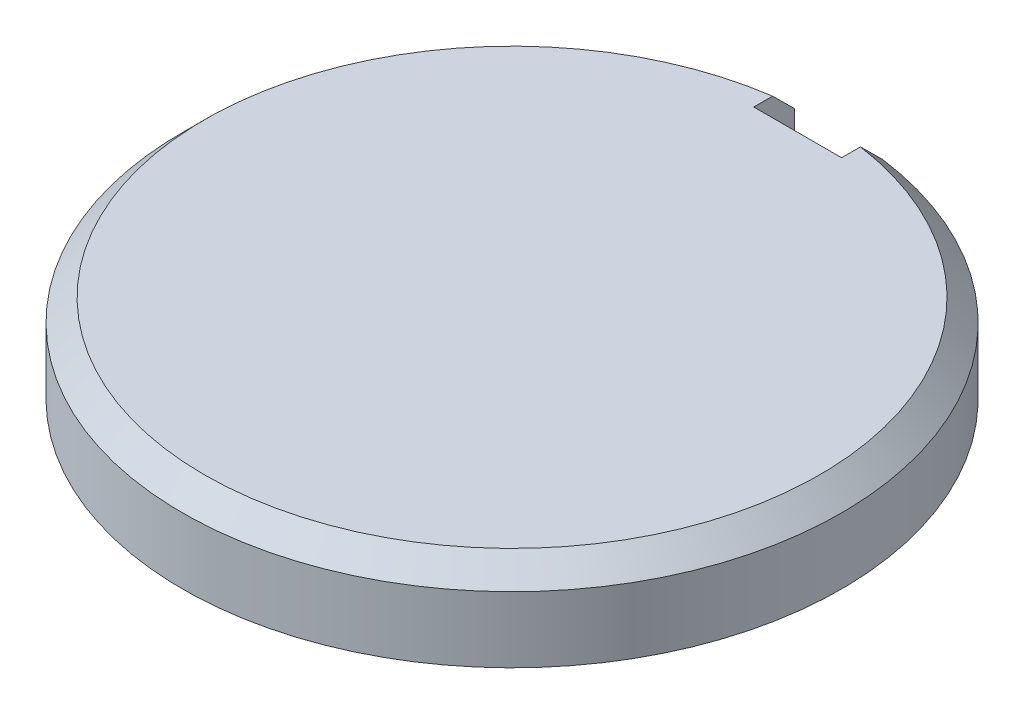
ISO-10303-21;
HEADER;
FILE_DESCRIPTION(('STEP AP214'),'2;1');
FILE_NAME('part.step','',(''),(''),'','','');
FILE_SCHEMA(('AUTOMOTIVE_DESIGN { 1 0 10303 214 1 1 1 1 }'));
ENDSEC;
DATA;
#1=APPLICATION_CONTEXT('core data for automotive mechanical design processes');
#2=APPLICATION_PROTOCOL_DEFINITION('international standard','automotive_design',2000,#1);
#3=PRODUCT_CONTEXT('',#1,'mechanical');
#4=PRODUCT('Part','Part','',(#3));
#5=PRODUCT_RELATED_PRODUCT_CATEGORY('part','',(#4));
#6=PRODUCT_DEFINITION_FORMATION('','',#4);
#7=PRODUCT_DEFINITION_CONTEXT('part definition',#1,'design');
#8=PRODUCT_DEFINITION('design','',#6,#7);
#9=PRODUCT_DEFINITION_SHAPE('','',#8);
#10=(LENGTH_UNIT() NAMED_UNIT(*) SI_UNIT(.MILLI.,.METRE.));
#11=(NAMED_UNIT(*) PLANE_ANGLE_UNIT() SI_UNIT($,.RADIAN.));
#12=(NAMED_UNIT(*) SI_UNIT($,.STERADIAN.) SOLID_ANGLE_UNIT());
#13=UNCERTAINTY_MEASURE_WITH_UNIT(LENGTH_MEASURE(1.E-05),#10,'distance_accuracy_value','');
#14=(GEOMETRIC_REPRESENTATION_CONTEXT(3) GLOBAL_UNCERTAINTY_ASSIGNED_CONTEXT((#13)) GLOBAL_UNIT_ASSIGNED_CONTEXT((#10,
#11,#12)) REPRESENTATION_CONTEXT('',''));
#15=CARTESIAN_POINT('',(0.,0.,0.));
#16=DIRECTION('',(0.,0.,1.));
#17=DIRECTION('',(1.,0.,0.));
#18=AXIS2_PLACEMENT_3D('',#15,#16,#17);
#19=CARTESIAN_POINT('',(0.,52.2,-62.));
#20=DIRECTION('',(0.,1.,0.));
#21=DIRECTION('',(0.,0.,1.));
#22=AXIS2_PLACEMENT_3D('',#19,#20,#21);
#23=PLANE('',#22);
#24=DIRECTION('',(-1.,0.,0.));
#25=VECTOR('',#24,1.);
#26=CARTESIAN_POINT('',(0.,52.2,-67.2));
#27=LINE('',#26,#25);
#28=CARTESIAN_POINT('',(0.8,52.2,-67.2));
#29=VERTEX_POINT('',#28);
#30=CARTESIAN_POINT('',(-0.8,52.2,-67.2));
#31=VERTEX_POINT('',#30);
#32=EDGE_CURVE('E204',#29,#31,#27,.T.);
#33=ORIENTED_EDGE('',*,*,#32,.T.);
#34=DIRECTION('',(0.,0.,-1.));
#35=VECTOR('',#34,1.);
#36=CARTESIAN_POINT('',(-0.8,52.2,-62.));
#37=LINE('',#36,#35);
#38=CARTESIAN_POINT('',(-0.8,52.2,-67.5425625842204));
#39=VERTEX_POINT('',#38);
#40=EDGE_CURVE('E191',#31,#39,#37,.T.);
#41=ORIENTED_EDGE('',*,*,#40,.T.);
#42=CARTESIAN_POINT('',(0.,52.2,-62.));
#43=DIRECTION('',(0.,-1.,0.));
#44=DIRECTION('',(0.,0.,-1.));
#45=AXIS2_PLACEMENT_3D('',#42,#43,#44);
#46=CIRCLE('',#45,5.6);
#47=CARTESIAN_POINT('',(0.8,52.2,-67.5425625842204));
#48=VERTEX_POINT('',#47);
#49=EDGE_CURVE('E355',#48,#39,#46,.T.);
#50=ORIENTED_EDGE('',*,*,#49,.F.);
#51=DIRECTION('',(0.,0.,1.));
#52=VECTOR('',#51,1.);
#53=CARTESIAN_POINT('',(0.8,52.2,-62.));
#54=LINE('',#53,#52);
#55=EDGE_CURVE('E210',#48,#29,#54,.T.);
#56=ORIENTED_EDGE('',*,*,#55,.T.);
#57=EDGE_LOOP('',(#33,#41,#50,#56));
#58=FACE_BOUND('',#57,.T.);
#59=ADVANCED_FACE('F47',(#58),#23,.T.);
#60=CARTESIAN_POINT('',(0.,51.8,-62.));
#61=DIRECTION('',(0.,-1.,0.));
#62=DIRECTION('',(0.,0.,-1.));
#63=AXIS2_PLACEMENT_3D('',#60,#61,#62);
#64=CONICAL_SURFACE('',#63,6.,0.785398163397452);
#65=ORIENTED_EDGE('',*,*,#49,.T.);
#66=CARTESIAN_POINT('',(-0.8,53.0946271909999,-66.6368667515551));
#67=CARTESIAN_POINT('',(-0.8,52.9126166868986,-66.8215553370668));
#68=CARTESIAN_POINT('',(-0.8,52.7304582431577,-67.0060979425622));
#69=CARTESIAN_POINT('',(-0.8,52.3659108831408,-67.374955064313));
#70=CARTESIAN_POINT('',(-0.8,52.1835219670777,-67.5592695807787));
#71=CARTESIAN_POINT('',(-0.8,51.8185788185969,-67.9277346494659));
#72=CARTESIAN_POINT('',(-0.8,51.6360245862569,-68.1118852017641));
#73=CARTESIAN_POINT('',(-0.8,51.2707866928955,-68.4800582504329));
#74=CARTESIAN_POINT('',(-0.8,51.0881030317565,-68.6640807466868));
#75=CARTESIAN_POINT('',(-0.8,50.9053728090001,-68.8480569582091));
#76=B_SPLINE_CURVE_WITH_KNOTS('',3,(#66,#67,#68,#69,#70,#71,#72,#73,#74,#75),.UNSPECIFIED.,.F.,
.F.,(4,2,2,2,4),(0.,0.777906711944224,1.55581270618922,2.33371833583191,3.11162467374074),.UNSPECIFIED.);
#77=CARTESIAN_POINT('',(-0.8,51.8,-67.9464274989274));
#78=VERTEX_POINT('',#77);
#79=EDGE_CURVE('E196',#39,#78,#76,.T.);
#80=ORIENTED_EDGE('',*,*,#79,.T.);
#81=CARTESIAN_POINT('',(0.,51.8,-62.));
#82=DIRECTION('',(0.,-1.,0.));
#83=DIRECTION('',(0.,0.,-1.));
#84=AXIS2_PLACEMENT_3D('',#81,#82,#83);
#85=CIRCLE('',#84,6.);
#86=CARTESIAN_POINT('',(0.8,51.8,-67.9464274989274));
#87=VERTEX_POINT('',#86);
#88=EDGE_CURVE('E351',#87,#78,#85,.T.);
#89=ORIENTED_EDGE('',*,*,#88,.F.);
#90=CARTESIAN_POINT('',(0.8,50.9053728090001,-68.8480569582091));
#91=CARTESIAN_POINT('',(0.8,51.0881030317565,-68.6640807466868));
#92=CARTESIAN_POINT('',(0.8,51.2707866928955,-68.4800582504329));
#93=CARTESIAN_POINT('',(0.8,51.6360245862569,-68.1118852017641));
#94=CARTESIAN_POINT('',(0.8,51.8185788185969,-67.9277346494659));
#95=CARTESIAN_POINT('',(0.8,52.1835219670777,-67.5592695807787));
#96=CARTESIAN_POINT('',(0.8,52.3659108831408,-67.374955064313));
#97=CARTESIAN_POINT('',(0.8,52.7304582431577,-67.0060979425621));
#98=CARTESIAN_POINT('',(0.8,52.9126166868986,-66.8215553370668));
#99=CARTESIAN_POINT('',(0.8,53.0946271909999,-66.6368667515551));
#100=B_SPLINE_CURVE_WITH_KNOTS('',3,(#90,#91,#92,#93,#94,#95,#96,#97,#98,#99),.UNSPECIFIED.,.F.,
.F.,(4,2,2,2,4),(0.,0.777906337908827,1.55581196755152,2.33371796179654,3.11162467374074),.UNSPECIFIED.);
#101=EDGE_CURVE('E217',#87,#48,#100,.T.);
#102=ORIENTED_EDGE('',*,*,#101,.T.);
#103=EDGE_LOOP('',(#65,#80,#89,#102));
#104=FACE_BOUND('',#103,.T.);
#105=ADVANCED_FACE('F231',(#104),#64,.T.);
#106=CARTESIAN_POINT('',(0.,44.4,-62.));
#107=DIRECTION('',(0.,-1.,0.));
#108=DIRECTION('',(0.,0.,-1.));
#109=AXIS2_PLACEMENT_3D('',#106,#107,#108);
#110=CYLINDRICAL_SURFACE('',#109,6.);
#111=ORIENTED_EDGE('',*,*,#88,.T.);
#112=DIRECTION('',(0.,-1.,0.));
#113=VECTOR('',#112,1.);
#114=CARTESIAN_POINT('',(-0.8,44.4,-67.9464274989274));
#115=LINE('',#114,#113);
#116=CARTESIAN_POINT('',(-0.8,50.6,-67.9464274989274));
#117=VERTEX_POINT('',#116);
#118=EDGE_CURVE('E253',#78,#117,#115,.T.);
#119=ORIENTED_EDGE('',*,*,#118,.T.);
#120=CARTESIAN_POINT('',(0.,50.6,-62.));
#121=DIRECTION('',(0.,-1.,0.));
#122=DIRECTION('',(0.,0.,-1.));
#123=AXIS2_PLACEMENT_3D('',#120,#121,#122);
#124=CIRCLE('',#123,6.);
#125=CARTESIAN_POINT('',(0.8,50.6,-67.9464274989274));
#126=VERTEX_POINT('',#125);
#127=EDGE_CURVE('E347',#126,#117,#124,.T.);
#128=ORIENTED_EDGE('',*,*,#127,.F.);
#129=DIRECTION('',(0.,-1.,0.));
#130=VECTOR('',#129,1.);
#131=CARTESIAN_POINT('',(0.8,44.4,-67.9464274989274));
#132=LINE('',#131,#130);
#133=EDGE_CURVE('E212',#126,#87,#132,.F.);
#134=ORIENTED_EDGE('',*,*,#133,.T.);
#135=EDGE_LOOP('',(#111,#119,#128,#134));
#136=FACE_BOUND('',#135,.T.);
#137=ADVANCED_FACE('F417',(#136),#110,.T.);
#138=CARTESIAN_POINT('',(6.,50.6,-62.));
#139=DIRECTION('',(0.,-1.,0.));
#140=DIRECTION('',(0.,0.,-1.));
#141=AXIS2_PLACEMENT_3D('',#138,#139,#140);
#142=PLANE('',#141);
#143=CARTESIAN_POINT('',(0.,50.6,-62.));
#144=DIRECTION('',(0.,-1.,0.));
#145=DIRECTION('',(0.,0.,-1.));
#146=AXIS2_PLACEMENT_3D('',#143,#144,#145);
#147=CIRCLE('',#146,3.);
#148=CARTESIAN_POINT('',(0.,50.6,-65.));
#149=VERTEX_POINT('',#148);
#150=EDGE_CURVE('E341',#149,#149,#147,.T.);
#151=ORIENTED_EDGE('',*,*,#150,.F.);
#152=EDGE_LOOP('',(#151));
#153=FACE_BOUND('',#152,.T.);
#154=ORIENTED_EDGE('',*,*,#127,.T.);
#155=DIRECTION('',(0.,0.,1.));
#156=VECTOR('',#155,1.);
#157=CARTESIAN_POINT('',(-0.8,50.6,-62.));
#158=LINE('',#157,#156);
#159=CARTESIAN_POINT('',(-0.8,50.6,-67.2));
#160=VERTEX_POINT('',#159);
#161=EDGE_CURVE('E11',#117,#160,#158,.T.);
#162=ORIENTED_EDGE('',*,*,#161,.T.);
#163=DIRECTION('',(1.,0.,0.));
#164=VECTOR('',#163,1.);
#165=CARTESIAN_POINT('',(6.,50.6,-67.2));
#166=LINE('',#165,#164);
#167=CARTESIAN_POINT('',(0.8,50.6,-67.2));
#168=VERTEX_POINT('',#167);
#169=EDGE_CURVE('E206',#160,#168,#166,.T.);
#170=ORIENTED_EDGE('',*,*,#169,.T.);
#171=DIRECTION('',(0.,0.,-1.));
#172=VECTOR('',#171,1.);
#173=CARTESIAN_POINT('',(0.8,50.6,-62.));
#174=LINE('',#173,#172);
#175=EDGE_CURVE('E56',#168,#126,#174,.T.);
#176=ORIENTED_EDGE('',*,*,#175,.T.);
#177=EDGE_LOOP('',(#154,#162,#170,#176));
#178=FACE_BOUND('',#177,.T.);
#179=ADVANCED_FACE('F414',(#153,#178),#142,.T.);
#180=CARTESIAN_POINT('',(3.,49.4,-62.));
#181=DIRECTION('',(0.,-1.,0.));
#182=DIRECTION('',(0.,0.,-1.));
#183=AXIS2_PLACEMENT_3D('',#180,#181,#182);
#184=PLANE('',#183);
#185=CARTESIAN_POINT('',(0.,49.4,-62.));
#186=DIRECTION('',(0.,-1.,0.));
#187=DIRECTION('',(0.,0.,-1.));
#188=AXIS2_PLACEMENT_3D('',#185,#186,#187);
#189=CIRCLE('',#188,3.);
#190=CARTESIAN_POINT('',(-0.4,49.4,-59.0267862505363));
#191=VERTEX_POINT('',#190);
#192=CARTESIAN_POINT('',(-2.9732137494637,49.4,-61.6));
#193=VERTEX_POINT('',#192);
#194=EDGE_CURVE('E343',#191,#193,#189,.T.);
#195=ORIENTED_EDGE('',*,*,#194,.T.);
#196=DIRECTION('',(1.,0.,0.));
#197=VECTOR('',#196,1.);
#198=CARTESIAN_POINT('',(3.,49.4,-61.6));
#199=LINE('',#198,#197);
#200=CARTESIAN_POINT('',(-2.26495033058123,49.4,-61.6));
#201=VERTEX_POINT('',#200);
#202=EDGE_CURVE('E275',#193,#201,#199,.T.);
#203=ORIENTED_EDGE('',*,*,#202,.T.);
#204=CARTESIAN_POINT('',(0.,49.4,-62.));
#205=DIRECTION('',(0.,-1.,0.));
#206=DIRECTION('',(0.,0.,-1.));
#207=AXIS2_PLACEMENT_3D('',#204,#205,#206);
#208=CIRCLE('',#207,2.3);
#209=CARTESIAN_POINT('',(-0.4,49.4,-59.7350496694188));
#210=VERTEX_POINT('',#209);
#211=EDGE_CURVE('E369',#210,#201,#208,.T.);
#212=ORIENTED_EDGE('',*,*,#211,.F.);
#213=DIRECTION('',(0.,0.,1.));
#214=VECTOR('',#213,1.);
#215=CARTESIAN_POINT('',(-0.4,49.4,-62.));
#216=LINE('',#215,#214);
#217=EDGE_CURVE('E328',#210,#191,#216,.T.);
#218=ORIENTED_EDGE('',*,*,#217,.T.);
#219=EDGE_LOOP('',(#195,#203,#212,#218));
#220=FACE_BOUND('',#219,.T.);
#221=ADVANCED_FACE('F479',(#220),#184,.T.);
#222=CARTESIAN_POINT('',(2.26495033058123,49.4,-61.6));
#223=VERTEX_POINT('',#222);
#224=CARTESIAN_POINT('',(0.4,49.4,-59.7350496694188));
#225=VERTEX_POINT('',#224);
#226=EDGE_CURVE('E368',#223,#225,#208,.T.);
#227=ORIENTED_EDGE('',*,*,#226,.F.);
#228=DIRECTION('',(1.,0.,0.));
#229=VECTOR('',#228,1.);
#230=CARTESIAN_POINT('',(3.,49.4,-61.6));
#231=LINE('',#230,#229);
#232=CARTESIAN_POINT('',(2.9732137494637,49.4,-61.6));
#233=VERTEX_POINT('',#232);
#234=EDGE_CURVE('E283',#223,#233,#231,.T.);
#235=ORIENTED_EDGE('',*,*,#234,.T.);
#236=CARTESIAN_POINT('',(0.4,49.4,-59.0267862505363));
#237=VERTEX_POINT('',#236);
#238=EDGE_CURVE('E342',#233,#237,#189,.T.);
#239=ORIENTED_EDGE('',*,*,#238,.T.);
#240=DIRECTION('',(0.,0.,-1.));
#241=VECTOR('',#240,1.);
#242=CARTESIAN_POINT('',(0.4,49.4,-62.));
#243=LINE('',#242,#241);
#244=EDGE_CURVE('E310',#237,#225,#243,.T.);
#245=ORIENTED_EDGE('',*,*,#244,.T.);
#246=EDGE_LOOP('',(#227,#235,#239,#245));
#247=FACE_BOUND('',#246,.T.);
#248=ADVANCED_FACE('F466',(#247),#184,.T.);
#249=CARTESIAN_POINT('',(0.,44.4,-62.));
#250=DIRECTION('',(0.,-1.,0.));
#251=DIRECTION('',(0.,0.,-1.));
#252=AXIS2_PLACEMENT_3D('',#249,#250,#251);
#253=CYLINDRICAL_SURFACE('',#252,2.3);
#254=CARTESIAN_POINT('',(0.,50.6,-62.));
#255=DIRECTION('',(0.,-1.,0.));
#256=DIRECTION('',(0.,0.,-1.));
#257=AXIS2_PLACEMENT_3D('',#254,#255,#256);
#258=CIRCLE('',#257,2.3);
#259=CARTESIAN_POINT('',(0.,50.6,-64.3));
#260=VERTEX_POINT('',#259);
#261=EDGE_CURVE('E358',#260,#260,#258,.T.);
#262=ORIENTED_EDGE('',*,*,#261,.F.);
#263=EDGE_LOOP('',(#262));
#264=FACE_BOUND('',#263,.T.);
#265=CARTESIAN_POINT('',(0.,50.58,-62.));
#266=DIRECTION('',(0.,-1.,0.));
#267=DIRECTION('',(0.,0.,-1.));
#268=AXIS2_PLACEMENT_3D('',#265,#266,#267);
#269=CIRCLE('',#268,2.3);
#270=CARTESIAN_POINT('',(2.26495033058123,50.58,-62.4));
#271=VERTEX_POINT('',#270);
#272=CARTESIAN_POINT('',(2.26495033058123,50.58,-61.6));
#273=VERTEX_POINT('',#272);
#274=EDGE_CURVE('E295',#271,#273,#269,.T.);
#275=ORIENTED_EDGE('',*,*,#274,.T.);
#276=DIRECTION('',(0.,-1.,0.));
#277=VECTOR('',#276,1.);
#278=CARTESIAN_POINT('',(2.26495033058123,44.4,-61.6));
#279=LINE('',#278,#277);
#280=EDGE_CURVE('E287',#273,#223,#279,.T.);
#281=ORIENTED_EDGE('',*,*,#280,.T.);
#282=ORIENTED_EDGE('',*,*,#226,.T.);
#283=DIRECTION('',(0.,-1.,0.));
#284=VECTOR('',#283,1.);
#285=CARTESIAN_POINT('',(0.4,44.4,-59.7350496694188));
#286=LINE('',#285,#284);
#287=CARTESIAN_POINT('',(0.4,50.58,-59.7350496694188));
#288=VERTEX_POINT('',#287);
#289=EDGE_CURVE('E314',#225,#288,#286,.F.);
#290=ORIENTED_EDGE('',*,*,#289,.T.);
#291=CARTESIAN_POINT('',(0.,50.58,-62.));
#292=DIRECTION('',(0.,-1.,0.));
#293=DIRECTION('',(0.,0.,-1.));
#294=AXIS2_PLACEMENT_3D('',#291,#292,#293);
#295=CIRCLE('',#294,2.3);
#296=CARTESIAN_POINT('',(-0.4,50.58,-59.7350496694188));
#297=VERTEX_POINT('',#296);
#298=EDGE_CURVE('E309',#288,#297,#295,.T.);
#299=ORIENTED_EDGE('',*,*,#298,.T.);
#300=DIRECTION('',(0.,-1.,0.));
#301=VECTOR('',#300,1.);
#302=CARTESIAN_POINT('',(-0.4,44.4,-59.7350496694188));
#303=LINE('',#302,#301);
#304=EDGE_CURVE('E332',#297,#210,#303,.T.);
#305=ORIENTED_EDGE('',*,*,#304,.T.);
#306=ORIENTED_EDGE('',*,*,#211,.T.);
#307=DIRECTION('',(0.,-1.,0.));
#308=VECTOR('',#307,1.);
#309=CARTESIAN_POINT('',(-2.26495033058123,44.4,-61.6));
#310=LINE('',#309,#308);
#311=CARTESIAN_POINT('',(-2.26495033058123,50.58,-61.6));
#312=VERTEX_POINT('',#311);
#313=EDGE_CURVE('E279',#201,#312,#310,.F.);
#314=ORIENTED_EDGE('',*,*,#313,.T.);
#315=CARTESIAN_POINT('',(-2.26495033058123,50.58,-62.4));
#316=VERTEX_POINT('',#315);
#317=EDGE_CURVE('E291',#312,#316,#269,.T.);
#318=ORIENTED_EDGE('',*,*,#317,.T.);
#319=DIRECTION('',(0.,-1.,0.));
#320=VECTOR('',#319,1.);
#321=CARTESIAN_POINT('',(-2.26495033058123,44.4,-62.4));
#322=LINE('',#321,#320);
#323=CARTESIAN_POINT('',(-2.26495033058123,49.4,-62.4));
#324=VERTEX_POINT('',#323);
#325=EDGE_CURVE('E266',#324,#316,#322,.F.);
#326=ORIENTED_EDGE('',*,*,#325,.F.);
#327=CARTESIAN_POINT('',(-0.4,49.4,-64.2649503305812));
#328=VERTEX_POINT('',#327);
#329=EDGE_CURVE('E362',#324,#328,#208,.T.);
#330=ORIENTED_EDGE('',*,*,#329,.T.);
#331=DIRECTION('',(0.,-1.,0.));
#332=VECTOR('',#331,1.);
#333=CARTESIAN_POINT('',(-0.4,44.4,-64.2649503305812));
#334=LINE('',#333,#332);
#335=CARTESIAN_POINT('',(-0.4,50.58,-64.2649503305812));
#336=VERTEX_POINT('',#335);
#337=EDGE_CURVE('E327',#328,#336,#334,.F.);
#338=ORIENTED_EDGE('',*,*,#337,.T.);
#339=CARTESIAN_POINT('',(0.4,50.58,-64.2649503305812));
#340=VERTEX_POINT('',#339);
#341=EDGE_CURVE('E305',#336,#340,#295,.T.);
#342=ORIENTED_EDGE('',*,*,#341,.T.);
#343=DIRECTION('',(0.,-1.,0.));
#344=VECTOR('',#343,1.);
#345=CARTESIAN_POINT('',(0.4,44.4,-64.2649503305812));
#346=LINE('',#345,#344);
#347=CARTESIAN_POINT('',(0.4,49.4,-64.2649503305812));
#348=VERTEX_POINT('',#347);
#349=EDGE_CURVE('E319',#340,#348,#346,.T.);
#350=ORIENTED_EDGE('',*,*,#349,.T.);
#351=CARTESIAN_POINT('',(2.26495033058123,49.4,-62.4));
#352=VERTEX_POINT('',#351);
#353=EDGE_CURVE('E363',#348,#352,#208,.T.);
#354=ORIENTED_EDGE('',*,*,#353,.T.);
#355=DIRECTION('',(0.,-1.,0.));
#356=VECTOR('',#355,1.);
#357=CARTESIAN_POINT('',(2.26495033058123,44.4,-62.4));
#358=LINE('',#357,#356);
#359=EDGE_CURVE('E272',#271,#352,#358,.T.);
#360=ORIENTED_EDGE('',*,*,#359,.F.);
#361=EDGE_LOOP('',(#275,#281,#282,#290,#299,#305,#306,#314,#318,#326,#330,#338,#342,#350,#354,#360));
#362=FACE_BOUND('',#361,.T.);
#363=ADVANCED_FACE('F462',(#264,#362),#253,.F.);
#364=CARTESIAN_POINT('',(0.,44.4,-62.));
#365=DIRECTION('',(0.,-1.,0.));
#366=DIRECTION('',(0.,0.,-1.));
#367=AXIS2_PLACEMENT_3D('',#364,#365,#366);
#368=CYLINDRICAL_SURFACE('',#367,3.);
#369=ORIENTED_EDGE('',*,*,#150,.T.);
#370=EDGE_LOOP('',(#369));
#371=FACE_BOUND('',#370,.T.);
#372=ORIENTED_EDGE('',*,*,#238,.F.);
#373=DIRECTION('',(0.,-1.,0.));
#374=VECTOR('',#373,1.);
#375=CARTESIAN_POINT('',(2.9732137494637,44.4,-61.6));
#376=LINE('',#375,#374);
#377=CARTESIAN_POINT('',(2.9732137494637,50.58,-61.6));
#378=VERTEX_POINT('',#377);
#379=EDGE_CURVE('E405',#233,#378,#376,.F.);
#380=ORIENTED_EDGE('',*,*,#379,.T.);
#381=CARTESIAN_POINT('',(0.,50.58,-62.));
#382=DIRECTION('',(0.,-1.,0.));
#383=DIRECTION('',(0.,0.,-1.));
#384=AXIS2_PLACEMENT_3D('',#381,#382,#383);
#385=CIRCLE('',#384,3.);
#386=CARTESIAN_POINT('',(2.9732137494637,50.58,-62.4));
#387=VERTEX_POINT('',#386);
#388=EDGE_CURVE('E398',#378,#387,#385,.F.);
#389=ORIENTED_EDGE('',*,*,#388,.T.);
#390=DIRECTION('',(0.,-1.,0.));
#391=VECTOR('',#390,1.);
#392=CARTESIAN_POINT('',(2.9732137494637,44.4,-62.4));
#393=LINE('',#392,#391);
#394=CARTESIAN_POINT('',(2.9732137494637,49.4,-62.4));
#395=VERTEX_POINT('',#394);
#396=EDGE_CURVE('E402',#395,#387,#393,.F.);
#397=ORIENTED_EDGE('',*,*,#396,.F.);
#398=CARTESIAN_POINT('',(0.4,49.4,-64.9732137494637));
#399=VERTEX_POINT('',#398);
#400=EDGE_CURVE('E337',#399,#395,#189,.T.);
#401=ORIENTED_EDGE('',*,*,#400,.F.);
#402=DIRECTION('',(0.,-1.,0.));
#403=VECTOR('',#402,1.);
#404=CARTESIAN_POINT('',(0.4,44.4,-64.9732137494637));
#405=LINE('',#404,#403);
#406=CARTESIAN_POINT('',(0.4,50.58,-64.9732137494637));
#407=VERTEX_POINT('',#406);
#408=EDGE_CURVE('E373',#399,#407,#405,.F.);
#409=ORIENTED_EDGE('',*,*,#408,.T.);
#410=CARTESIAN_POINT('',(0.,50.58,-62.));
#411=DIRECTION('',(0.,-1.,0.));
#412=DIRECTION('',(0.,0.,-1.));
#413=AXIS2_PLACEMENT_3D('',#410,#411,#412);
#414=CIRCLE('',#413,3.);
#415=CARTESIAN_POINT('',(-0.4,50.58,-64.9732137494637));
#416=VERTEX_POINT('',#415);
#417=EDGE_CURVE('E367',#407,#416,#414,.F.);
#418=ORIENTED_EDGE('',*,*,#417,.T.);
#419=DIRECTION('',(0.,-1.,0.));
#420=VECTOR('',#419,1.);
#421=CARTESIAN_POINT('',(-0.4,44.4,-64.9732137494637));
#422=LINE('',#421,#420);
#423=CARTESIAN_POINT('',(-0.4,49.4,-64.9732137494637));
#424=VERTEX_POINT('',#423);
#425=EDGE_CURVE('E378',#416,#424,#422,.T.);
#426=ORIENTED_EDGE('',*,*,#425,.T.);
#427=CARTESIAN_POINT('',(-2.9732137494637,49.4,-62.4));
#428=VERTEX_POINT('',#427);
#429=EDGE_CURVE('E336',#428,#424,#189,.T.);
#430=ORIENTED_EDGE('',*,*,#429,.F.);
#431=DIRECTION('',(0.,-1.,0.));
#432=VECTOR('',#431,1.);
#433=CARTESIAN_POINT('',(-2.9732137494637,44.4,-62.4));
#434=LINE('',#433,#432);
#435=CARTESIAN_POINT('',(-2.9732137494637,50.58,-62.4));
#436=VERTEX_POINT('',#435);
#437=EDGE_CURVE('E390',#436,#428,#434,.T.);
#438=ORIENTED_EDGE('',*,*,#437,.F.);
#439=CARTESIAN_POINT('',(-2.9732137494637,50.58,-61.6));
#440=VERTEX_POINT('',#439);
#441=EDGE_CURVE('E393',#436,#440,#385,.F.);
#442=ORIENTED_EDGE('',*,*,#441,.T.);
#443=DIRECTION('',(0.,-1.,0.));
#444=VECTOR('',#443,1.);
#445=CARTESIAN_POINT('',(-2.9732137494637,44.4,-61.6));
#446=LINE('',#445,#444);
#447=EDGE_CURVE('E397',#440,#193,#446,.T.);
#448=ORIENTED_EDGE('',*,*,#447,.T.);
#449=ORIENTED_EDGE('',*,*,#194,.F.);
#450=DIRECTION('',(0.,-1.,0.));
#451=VECTOR('',#450,1.);
#452=CARTESIAN_POINT('',(-0.4,44.4,-59.0267862505363));
#453=LINE('',#452,#451);
#454=CARTESIAN_POINT('',(-0.4,50.58,-59.0267862505363));
#455=VERTEX_POINT('',#454);
#456=EDGE_CURVE('E386',#191,#455,#453,.F.);
#457=ORIENTED_EDGE('',*,*,#456,.T.);
#458=CARTESIAN_POINT('',(0.4,50.58,-59.0267862505363));
#459=VERTEX_POINT('',#458);
#460=EDGE_CURVE('E374',#455,#459,#414,.F.);
#461=ORIENTED_EDGE('',*,*,#460,.T.);
#462=DIRECTION('',(0.,-1.,0.));
#463=VECTOR('',#462,1.);
#464=CARTESIAN_POINT('',(0.4,44.4,-59.0267862505363));
#465=LINE('',#464,#463);
#466=EDGE_CURVE('E382',#459,#237,#465,.T.);
#467=ORIENTED_EDGE('',*,*,#466,.T.);
#468=EDGE_LOOP('',(#372,#380,#389,#397,#401,#409,#418,#426,#430,#438,#442,#448,#449,#457,#461,#467));
#469=FACE_BOUND('',#468,.T.);
#470=ADVANCED_FACE('F452',(#371,#469),#368,.T.);
#471=DIRECTION('',(1.,0.,0.));
#472=VECTOR('',#471,1.);
#473=CARTESIAN_POINT('',(3.,49.4,-62.4));
#474=LINE('',#473,#472);
#475=EDGE_CURVE('E263',#428,#324,#474,.T.);
#476=ORIENTED_EDGE('',*,*,#475,.F.);
#477=ORIENTED_EDGE('',*,*,#429,.T.);
#478=EDGE_CURVE('E323',#424,#328,#216,.T.);
#479=ORIENTED_EDGE('',*,*,#478,.T.);
#480=ORIENTED_EDGE('',*,*,#329,.F.);
#481=EDGE_LOOP('',(#476,#477,#479,#480));
#482=FACE_BOUND('',#481,.T.);
#483=ADVANCED_FACE('F49',(#482),#184,.T.);
#484=DIRECTION('',(1.,0.,0.));
#485=VECTOR('',#484,1.);
#486=CARTESIAN_POINT('',(3.,49.4,-62.4));
#487=LINE('',#486,#485);
#488=EDGE_CURVE('E269',#352,#395,#487,.T.);
#489=ORIENTED_EDGE('',*,*,#488,.F.);
#490=ORIENTED_EDGE('',*,*,#353,.F.);
#491=EDGE_CURVE('E315',#348,#399,#243,.T.);
#492=ORIENTED_EDGE('',*,*,#491,.T.);
#493=ORIENTED_EDGE('',*,*,#400,.T.);
#494=EDGE_LOOP('',(#489,#490,#492,#493));
#495=FACE_BOUND('',#494,.T.);
#496=ADVANCED_FACE('F504',(#495),#184,.T.);
#497=CARTESIAN_POINT('',(2.3,50.6,-62.));
#498=DIRECTION('',(0.,-1.,0.));
#499=DIRECTION('',(0.,0.,-1.));
#500=AXIS2_PLACEMENT_3D('',#497,#498,#499);
#501=PLANE('',#500);
#502=ORIENTED_EDGE('',*,*,#261,.T.);
#503=EDGE_LOOP('',(#502));
#504=FACE_BOUND('',#503,.T.);
#505=ADVANCED_FACE('F520',(#504),#501,.T.);
#506=CARTESIAN_POINT('',(-0.4,50.58,-58.8));
#507=DIRECTION('',(0.,-1.,0.));
#508=DIRECTION('',(0.,0.,-1.));
#509=AXIS2_PLACEMENT_3D('',#506,#507,#508);
#510=PLANE('',#509);
#511=DIRECTION('',(0.,0.,-1.));
#512=VECTOR('',#511,1.);
#513=CARTESIAN_POINT('',(-0.4,50.58,-58.8));
#514=LINE('',#513,#512);
#515=EDGE_CURVE('E296',#336,#416,#514,.T.);
#516=ORIENTED_EDGE('',*,*,#515,.T.);
#517=ORIENTED_EDGE('',*,*,#417,.F.);
#518=DIRECTION('',(0.,0.,-1.));
#519=VECTOR('',#518,1.);
#520=CARTESIAN_POINT('',(0.4,50.58,-58.8));
#521=LINE('',#520,#519);
#522=EDGE_CURVE('E300',#340,#407,#521,.T.);
#523=ORIENTED_EDGE('',*,*,#522,.F.);
#524=ORIENTED_EDGE('',*,*,#341,.F.);
#525=EDGE_LOOP('',(#516,#517,#523,#524));
#526=FACE_BOUND('',#525,.T.);
#527=ADVANCED_FACE('F498',(#526),#510,.T.);
#528=CARTESIAN_POINT('',(0.4,49.3,-58.8));
#529=DIRECTION('',(-1.,0.,0.));
#530=DIRECTION('',(0.,0.,1.));
#531=AXIS2_PLACEMENT_3D('',#528,#529,#530);
#532=PLANE('',#531);
#533=ORIENTED_EDGE('',*,*,#522,.T.);
#534=ORIENTED_EDGE('',*,*,#408,.F.);
#535=ORIENTED_EDGE('',*,*,#491,.F.);
#536=ORIENTED_EDGE('',*,*,#349,.F.);
#537=EDGE_LOOP('',(#533,#534,#535,#536));
#538=FACE_BOUND('',#537,.T.);
#539=ADVANCED_FACE('F500',(#538),#532,.T.);
#540=CARTESIAN_POINT('',(-0.4,49.3,-58.8));
#541=DIRECTION('',(1.,0.,0.));
#542=DIRECTION('',(0.,0.,-1.));
#543=AXIS2_PLACEMENT_3D('',#540,#541,#542);
#544=PLANE('',#543);
#545=ORIENTED_EDGE('',*,*,#478,.F.);
#546=ORIENTED_EDGE('',*,*,#425,.F.);
#547=ORIENTED_EDGE('',*,*,#515,.F.);
#548=ORIENTED_EDGE('',*,*,#337,.F.);
#549=EDGE_LOOP('',(#545,#546,#547,#548));
#550=FACE_BOUND('',#549,.T.);
#551=ADVANCED_FACE('F494',(#550),#544,.T.);
#552=EDGE_CURVE('E299',#455,#297,#514,.T.);
#553=ORIENTED_EDGE('',*,*,#552,.F.);
#554=ORIENTED_EDGE('',*,*,#456,.F.);
#555=ORIENTED_EDGE('',*,*,#217,.F.);
#556=ORIENTED_EDGE('',*,*,#304,.F.);
#557=EDGE_LOOP('',(#553,#554,#555,#556));
#558=FACE_BOUND('',#557,.T.);
#559=ADVANCED_FACE('F476',(#558),#544,.T.);
#560=EDGE_CURVE('E304',#459,#288,#521,.T.);
#561=ORIENTED_EDGE('',*,*,#560,.F.);
#562=ORIENTED_EDGE('',*,*,#460,.F.);
#563=ORIENTED_EDGE('',*,*,#552,.T.);
#564=ORIENTED_EDGE('',*,*,#298,.F.);
#565=EDGE_LOOP('',(#561,#562,#563,#564));
#566=FACE_BOUND('',#565,.T.);
#567=ADVANCED_FACE('F474',(#566),#510,.T.);
#568=ORIENTED_EDGE('',*,*,#244,.F.);
#569=ORIENTED_EDGE('',*,*,#466,.F.);
#570=ORIENTED_EDGE('',*,*,#560,.T.);
#571=ORIENTED_EDGE('',*,*,#289,.F.);
#572=EDGE_LOOP('',(#568,#569,#570,#571));
#573=FACE_BOUND('',#572,.T.);
#574=ADVANCED_FACE('F470',(#573),#532,.T.);
#575=CARTESIAN_POINT('',(0.,0.,-62.4));
#576=DIRECTION('',(0.,0.,-1.));
#577=DIRECTION('',(-1.,0.,0.));
#578=AXIS2_PLACEMENT_3D('',#575,#576,#577);
#579=PLANE('',#578);
#580=ORIENTED_EDGE('',*,*,#325,.T.);
#581=DIRECTION('',(-1.,0.,0.));
#582=VECTOR('',#581,1.);
#583=CARTESIAN_POINT('',(-3.2,50.58,-62.4));
#584=LINE('',#583,#582);
#585=EDGE_CURVE('E71',#316,#436,#584,.T.);
#586=ORIENTED_EDGE('',*,*,#585,.T.);
#587=ORIENTED_EDGE('',*,*,#437,.T.);
#588=ORIENTED_EDGE('',*,*,#475,.T.);
#589=EDGE_LOOP('',(#580,#586,#587,#588));
#590=FACE_BOUND('',#589,.T.);
#591=ADVANCED_FACE('F507',(#590),#579,.F.);
#592=CARTESIAN_POINT('',(0.,0.,-61.6));
#593=DIRECTION('',(0.,0.,-1.));
#594=DIRECTION('',(-1.,0.,0.));
#595=AXIS2_PLACEMENT_3D('',#592,#593,#594);
#596=PLANE('',#595);
#597=ORIENTED_EDGE('',*,*,#202,.F.);
#598=ORIENTED_EDGE('',*,*,#447,.F.);
#599=DIRECTION('',(-1.,0.,0.));
#600=VECTOR('',#599,1.);
#601=CARTESIAN_POINT('',(-3.2,50.58,-61.6));
#602=LINE('',#601,#600);
#603=EDGE_CURVE('E255',#312,#440,#602,.T.);
#604=ORIENTED_EDGE('',*,*,#603,.F.);
#605=ORIENTED_EDGE('',*,*,#313,.F.);
#606=EDGE_LOOP('',(#597,#598,#604,#605));
#607=FACE_BOUND('',#606,.T.);
#608=ADVANCED_FACE('F245',(#607),#596,.T.);
#609=CARTESIAN_POINT('',(-3.2,50.58,-61.6));
#610=DIRECTION('',(0.,-1.,0.));
#611=DIRECTION('',(0.,0.,-1.));
#612=AXIS2_PLACEMENT_3D('',#609,#610,#611);
#613=PLANE('',#612);
#614=ORIENTED_EDGE('',*,*,#603,.T.);
#615=ORIENTED_EDGE('',*,*,#441,.F.);
#616=ORIENTED_EDGE('',*,*,#585,.F.);
#617=ORIENTED_EDGE('',*,*,#317,.F.);
#618=EDGE_LOOP('',(#614,#615,#616,#617));
#619=FACE_BOUND('',#618,.T.);
#620=ADVANCED_FACE('F485',(#619),#613,.T.);
#621=EDGE_CURVE('E260',#387,#271,#584,.T.);
#622=ORIENTED_EDGE('',*,*,#621,.F.);
#623=ORIENTED_EDGE('',*,*,#388,.F.);
#624=EDGE_CURVE('E259',#378,#273,#602,.T.);
#625=ORIENTED_EDGE('',*,*,#624,.T.);
#626=ORIENTED_EDGE('',*,*,#274,.F.);
#627=EDGE_LOOP('',(#622,#623,#625,#626));
#628=FACE_BOUND('',#627,.T.);
#629=ADVANCED_FACE('F457',(#628),#613,.T.);
#630=ORIENTED_EDGE('',*,*,#624,.F.);
#631=ORIENTED_EDGE('',*,*,#379,.F.);
#632=ORIENTED_EDGE('',*,*,#234,.F.);
#633=ORIENTED_EDGE('',*,*,#280,.F.);
#634=EDGE_LOOP('',(#630,#631,#632,#633));
#635=FACE_BOUND('',#634,.T.);
#636=ADVANCED_FACE('F459',(#635),#596,.T.);
#637=ORIENTED_EDGE('',*,*,#359,.T.);
#638=ORIENTED_EDGE('',*,*,#488,.T.);
#639=ORIENTED_EDGE('',*,*,#396,.T.);
#640=ORIENTED_EDGE('',*,*,#621,.T.);
#641=EDGE_LOOP('',(#637,#638,#639,#640));
#642=FACE_BOUND('',#641,.T.);
#643=ADVANCED_FACE('F244',(#642),#579,.F.);
#644=CARTESIAN_POINT('',(-0.8,50.5,-67.2));
#645=DIRECTION('',(1.,0.,0.));
#646=DIRECTION('',(0.,0.,-1.));
#647=AXIS2_PLACEMENT_3D('',#644,#645,#646);
#648=PLANE('',#647);
#649=DIRECTION('',(0.,-1.,0.));
#650=VECTOR('',#649,1.);
#651=CARTESIAN_POINT('',(-0.8,50.5,-67.2));
#652=LINE('',#651,#650);
#653=EDGE_CURVE('E194',#31,#160,#652,.T.);
#654=ORIENTED_EDGE('',*,*,#653,.T.);
#655=ORIENTED_EDGE('',*,*,#161,.F.);
#656=ORIENTED_EDGE('',*,*,#118,.F.);
#657=ORIENTED_EDGE('',*,*,#79,.F.);
#658=ORIENTED_EDGE('',*,*,#40,.F.);
#659=EDGE_LOOP('',(#654,#655,#656,#657,#658));
#660=FACE_BOUND('',#659,.T.);
#661=ADVANCED_FACE('F193',(#660),#648,.T.);
#662=CARTESIAN_POINT('',(0.8,50.5,-67.2));
#663=DIRECTION('',(-1.,0.,0.));
#664=DIRECTION('',(0.,0.,1.));
#665=AXIS2_PLACEMENT_3D('',#662,#663,#664);
#666=PLANE('',#665);
#667=ORIENTED_EDGE('',*,*,#101,.F.);
#668=ORIENTED_EDGE('',*,*,#133,.F.);
#669=ORIENTED_EDGE('',*,*,#175,.F.);
#670=DIRECTION('',(0.,1.,0.));
#671=VECTOR('',#670,1.);
#672=CARTESIAN_POINT('',(0.8,50.5,-67.2));
#673=LINE('',#672,#671);
#674=EDGE_CURVE('E63',#168,#29,#673,.T.);
#675=ORIENTED_EDGE('',*,*,#674,.T.);
#676=ORIENTED_EDGE('',*,*,#55,.F.);
#677=EDGE_LOOP('',(#667,#668,#669,#675,#676));
#678=FACE_BOUND('',#677,.T.);
#679=ADVANCED_FACE('F235',(#678),#666,.T.);
#680=CARTESIAN_POINT('',(0.,0.,-67.2));
#681=DIRECTION('',(0.,0.,-1.));
#682=DIRECTION('',(-1.,0.,0.));
#683=AXIS2_PLACEMENT_3D('',#680,#681,#682);
#684=PLANE('',#683);
#685=ORIENTED_EDGE('',*,*,#674,.F.);
#686=ORIENTED_EDGE('',*,*,#169,.F.);
#687=ORIENTED_EDGE('',*,*,#653,.F.);
#688=ORIENTED_EDGE('',*,*,#32,.F.);
#689=EDGE_LOOP('',(#685,#686,#687,#688));
#690=FACE_BOUND('',#689,.T.);
#691=ADVANCED_FACE('F203',(#690),#684,.T.);
#692=CLOSED_SHELL('',(#59,#105,#137,#179,#221,#248,#363,#470,#483,#496,#505,#527,#539,#551,#559,
#567,#574,#591,#608,#620,#629,#636,#643,#661,#679,#691));
#693=MANIFOLD_SOLID_BREP('B2',#692);
#694=ADVANCED_BREP_SHAPE_REPRESENTATION('',(#18,#693),#14);
#695=SHAPE_DEFINITION_REPRESENTATION(#9,#694);
ENDSEC;
END-ISO-10303-21;
